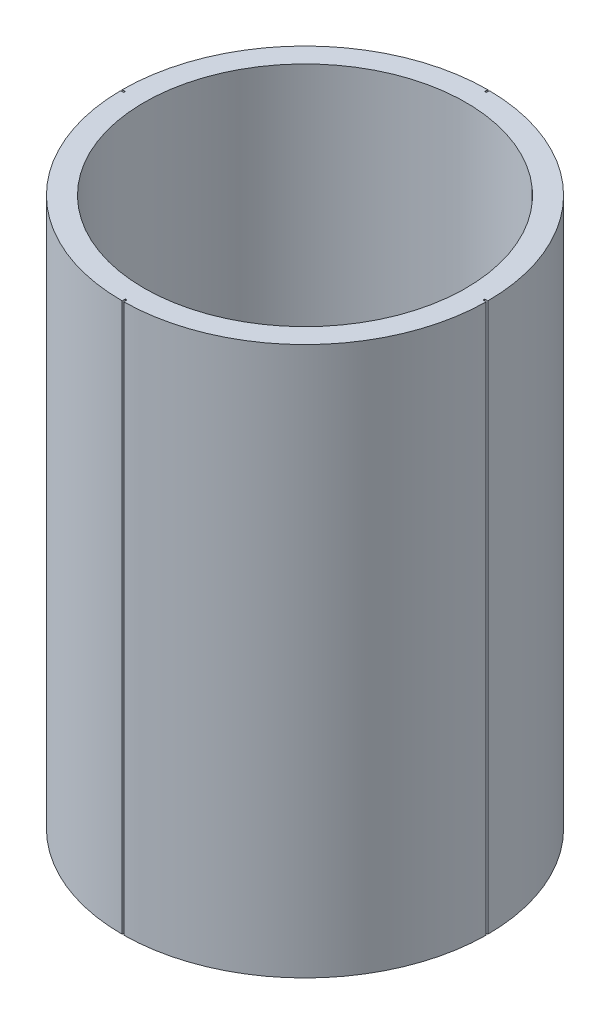
ISO-10303-21;
HEADER;
FILE_DESCRIPTION(('STEP AP214'),'2;1');
FILE_NAME('part.step','',(''),(''),'','','');
FILE_SCHEMA(('AUTOMOTIVE_DESIGN { 1 0 10303 214 1 1 1 1 }'));
ENDSEC;
DATA;
#1=APPLICATION_CONTEXT('core data for automotive mechanical design processes');
#2=APPLICATION_PROTOCOL_DEFINITION('international standard','automotive_design',2000,#1);
#3=PRODUCT_CONTEXT('',#1,'mechanical');
#4=PRODUCT('Part','Part','',(#3));
#5=PRODUCT_RELATED_PRODUCT_CATEGORY('part','',(#4));
#6=PRODUCT_DEFINITION_FORMATION('','',#4);
#7=PRODUCT_DEFINITION_CONTEXT('part definition',#1,'design');
#8=PRODUCT_DEFINITION('design','',#6,#7);
#9=PRODUCT_DEFINITION_SHAPE('','',#8);
#10=(LENGTH_UNIT() NAMED_UNIT(*) SI_UNIT(.MILLI.,.METRE.));
#11=(NAMED_UNIT(*) PLANE_ANGLE_UNIT() SI_UNIT($,.RADIAN.));
#12=(NAMED_UNIT(*) SI_UNIT($,.STERADIAN.) SOLID_ANGLE_UNIT());
#13=UNCERTAINTY_MEASURE_WITH_UNIT(LENGTH_MEASURE(1.E-05),#10,'distance_accuracy_value','');
#14=(GEOMETRIC_REPRESENTATION_CONTEXT(3) GLOBAL_UNCERTAINTY_ASSIGNED_CONTEXT((#13)) GLOBAL_UNIT_ASSIGNED_CONTEXT((#10,
#11,#12)) REPRESENTATION_CONTEXT('',''));
#15=CARTESIAN_POINT('',(0.,0.,0.));
#16=DIRECTION('',(0.,0.,1.));
#17=DIRECTION('',(1.,0.,0.));
#18=AXIS2_PLACEMENT_3D('',#15,#16,#17);
#19=CARTESIAN_POINT('',(0.,15.,0.));
#20=DIRECTION('',(0.,1.,0.));
#21=DIRECTION('',(0.,0.,1.));
#22=AXIS2_PLACEMENT_3D('',#19,#20,#21);
#23=PLANE('',#22);
#24=CARTESIAN_POINT('',(0.,15.,0.));
#25=DIRECTION('',(0.,1.,0.));
#26=DIRECTION('',(0.,0.,1.));
#27=AXIS2_PLACEMENT_3D('',#24,#25,#26);
#28=CIRCLE('',#27,5.);
#29=CARTESIAN_POINT('',(0.0436326774918692,15.,4.99980961532086));
#30=VERTEX_POINT('',#29);
#31=CARTESIAN_POINT('',(4.99980961532086,15.,0.0436326774918726));
#32=VERTEX_POINT('',#31);
#33=EDGE_CURVE('E208',#30,#32,#28,.T.);
#34=ORIENTED_EDGE('',*,*,#33,.T.);
#35=DIRECTION('',(-0.999961923064171,0.,-0.00872653549837457));
#36=VECTOR('',#35,1.);
#37=CARTESIAN_POINT('',(4.99980961532086,15.,0.0436326774918726));
#38=LINE('',#37,#36);
#39=CARTESIAN_POINT('',(4.9150518983708,15.,0.0428930081018029));
#40=VERTEX_POINT('',#39);
#41=EDGE_CURVE('E116',#32,#40,#38,.T.);
#42=ORIENTED_EDGE('',*,*,#41,.T.);
#43=DIRECTION('',(0.,0.,-1.));
#44=VECTOR('',#43,1.);
#45=CARTESIAN_POINT('',(4.9150518983708,15.,0.));
#46=LINE('',#45,#44);
#47=CARTESIAN_POINT('',(4.9150518983708,15.,0.));
#48=VERTEX_POINT('',#47);
#49=EDGE_CURVE('E247',#40,#48,#46,.T.);
#50=ORIENTED_EDGE('',*,*,#49,.T.);
#51=DIRECTION('',(1.,0.,0.));
#52=VECTOR('',#51,1.);
#53=CARTESIAN_POINT('',(4.9150518983708,15.,0.));
#54=LINE('',#53,#52);
#55=CARTESIAN_POINT('',(5.,15.,0.));
#56=VERTEX_POINT('',#55);
#57=EDGE_CURVE('E266',#48,#56,#54,.T.);
#58=ORIENTED_EDGE('',*,*,#57,.T.);
#59=CARTESIAN_POINT('',(0.,15.,0.));
#60=DIRECTION('',(0.,1.,0.));
#61=DIRECTION('',(0.,0.,1.));
#62=AXIS2_PLACEMENT_3D('',#59,#60,#61);
#63=CIRCLE('',#62,5.);
#64=CARTESIAN_POINT('',(0.0436326774918698,15.,-4.99980961532086));
#65=VERTEX_POINT('',#64);
#66=EDGE_CURVE('E263',#56,#65,#63,.T.);
#67=ORIENTED_EDGE('',*,*,#66,.T.);
#68=DIRECTION('',(-0.00872653549837389,0.,0.999961923064171));
#69=VECTOR('',#68,1.);
#70=CARTESIAN_POINT('',(0.0436326774918692,15.,-4.99980961532086));
#71=LINE('',#70,#69);
#72=CARTESIAN_POINT('',(0.0428689280640921,15.,-4.91229259935485));
#73=VERTEX_POINT('',#72);
#74=EDGE_CURVE('E265',#65,#73,#71,.T.);
#75=ORIENTED_EDGE('',*,*,#74,.T.);
#76=DIRECTION('',(-1.,0.,0.));
#77=VECTOR('',#76,1.);
#78=CARTESIAN_POINT('',(0.,15.,-4.91229259935485));
#79=LINE('',#78,#77);
#80=CARTESIAN_POINT('',(0.,15.,-4.91229259935485));
#81=VERTEX_POINT('',#80);
#82=EDGE_CURVE('E268',#73,#81,#79,.T.);
#83=ORIENTED_EDGE('',*,*,#82,.T.);
#84=DIRECTION('',(0.,0.,-1.));
#85=VECTOR('',#84,1.);
#86=CARTESIAN_POINT('',(0.,15.,-5.));
#87=LINE('',#86,#85);
#88=CARTESIAN_POINT('',(0.,15.,-5.));
#89=VERTEX_POINT('',#88);
#90=EDGE_CURVE('E274',#81,#89,#87,.T.);
#91=ORIENTED_EDGE('',*,*,#90,.T.);
#92=CARTESIAN_POINT('',(0.,15.,0.));
#93=DIRECTION('',(0.,1.,0.));
#94=DIRECTION('',(0.,0.,1.));
#95=AXIS2_PLACEMENT_3D('',#92,#93,#94);
#96=CIRCLE('',#95,5.);
#97=CARTESIAN_POINT('',(-5.,15.,0.));
#98=VERTEX_POINT('',#97);
#99=EDGE_CURVE('E276',#89,#98,#96,.T.);
#100=ORIENTED_EDGE('',*,*,#99,.T.);
#101=DIRECTION('',(1.,0.,0.));
#102=VECTOR('',#101,1.);
#103=CARTESIAN_POINT('',(-5.,15.,0.));
#104=LINE('',#103,#102);
#105=CARTESIAN_POINT('',(-4.9150518983708,15.,0.));
#106=VERTEX_POINT('',#105);
#107=EDGE_CURVE('E278',#98,#106,#104,.T.);
#108=ORIENTED_EDGE('',*,*,#107,.T.);
#109=DIRECTION('',(0.,0.,1.));
#110=VECTOR('',#109,1.);
#111=CARTESIAN_POINT('',(-4.9150518983708,15.,0.));
#112=LINE('',#111,#110);
#113=CARTESIAN_POINT('',(-4.9150518983708,15.,0.0428930081018029));
#114=VERTEX_POINT('',#113);
#115=EDGE_CURVE('E280',#106,#114,#112,.T.);
#116=ORIENTED_EDGE('',*,*,#115,.T.);
#117=DIRECTION('',(-0.999961923064171,0.,0.00872653549837457));
#118=VECTOR('',#117,1.);
#119=CARTESIAN_POINT('',(-4.99980961532086,15.,0.0436326774918726));
#120=LINE('',#119,#118);
#121=CARTESIAN_POINT('',(-4.99980961532086,15.,0.0436326774918726));
#122=VERTEX_POINT('',#121);
#123=EDGE_CURVE('E282',#114,#122,#120,.T.);
#124=ORIENTED_EDGE('',*,*,#123,.T.);
#125=CARTESIAN_POINT('',(0.,15.,0.));
#126=DIRECTION('',(0.,1.,0.));
#127=DIRECTION('',(0.,0.,1.));
#128=AXIS2_PLACEMENT_3D('',#125,#126,#127);
#129=CIRCLE('',#128,5.);
#130=CARTESIAN_POINT('',(0.,15.,5.));
#131=VERTEX_POINT('',#130);
#132=EDGE_CURVE('E159',#122,#131,#129,.T.);
#133=ORIENTED_EDGE('',*,*,#132,.T.);
#134=DIRECTION('',(0.,0.,-1.));
#135=VECTOR('',#134,1.);
#136=CARTESIAN_POINT('',(0.,15.,5.));
#137=LINE('',#136,#135);
#138=CARTESIAN_POINT('',(0.,15.,4.91229259935485));
#139=VERTEX_POINT('',#138);
#140=EDGE_CURVE('E153',#131,#139,#137,.T.);
#141=ORIENTED_EDGE('',*,*,#140,.T.);
#142=DIRECTION('',(1.,0.,0.));
#143=VECTOR('',#142,1.);
#144=CARTESIAN_POINT('',(0.,15.,4.91229259935485));
#145=LINE('',#144,#143);
#146=CARTESIAN_POINT('',(0.0428689280640921,15.,4.91229259935485));
#147=VERTEX_POINT('',#146);
#148=EDGE_CURVE('E157',#139,#147,#145,.T.);
#149=ORIENTED_EDGE('',*,*,#148,.T.);
#150=DIRECTION('',(0.00872653549837389,0.,0.999961923064171));
#151=VECTOR('',#150,1.);
#152=CARTESIAN_POINT('',(0.0436326774918692,15.,4.99980961532086));
#153=LINE('',#152,#151);
#154=EDGE_CURVE('E49',#147,#30,#153,.T.);
#155=ORIENTED_EDGE('',*,*,#154,.T.);
#156=EDGE_LOOP('',(#34,#42,#50,#58,#67,#75,#83,#91,#100,#108,#116,#124,#133,#141,#149,#155));
#157=FACE_BOUND('',#156,.T.);
#158=CARTESIAN_POINT('',(0.,15.,0.));
#159=DIRECTION('',(0.,1.,0.));
#160=DIRECTION('',(0.,0.,1.));
#161=AXIS2_PLACEMENT_3D('',#158,#159,#160);
#162=CIRCLE('',#161,4.4);
#163=CARTESIAN_POINT('',(0.,15.,4.4));
#164=VERTEX_POINT('',#163);
#165=EDGE_CURVE('E181',#164,#164,#162,.T.);
#166=ORIENTED_EDGE('',*,*,#165,.F.);
#167=EDGE_LOOP('',(#166));
#168=FACE_BOUND('',#167,.T.);
#169=ADVANCED_FACE('F32',(#157,#168),#23,.T.);
#170=CARTESIAN_POINT('',(0.,0.,0.));
#171=DIRECTION('',(0.,1.,0.));
#172=DIRECTION('',(0.,0.,1.));
#173=AXIS2_PLACEMENT_3D('',#170,#171,#172);
#174=PLANE('',#173);
#175=CARTESIAN_POINT('',(0.,0.,0.));
#176=DIRECTION('',(0.,1.,0.));
#177=DIRECTION('',(0.,0.,1.));
#178=AXIS2_PLACEMENT_3D('',#175,#176,#177);
#179=CIRCLE('',#178,5.);
#180=CARTESIAN_POINT('',(0.0436326774918692,0.,4.99980961532086));
#181=VERTEX_POINT('',#180);
#182=CARTESIAN_POINT('',(4.99980961532086,0.,0.0436326774918726));
#183=VERTEX_POINT('',#182);
#184=EDGE_CURVE('E177',#181,#183,#179,.T.);
#185=ORIENTED_EDGE('',*,*,#184,.F.);
#186=DIRECTION('',(0.00872653549837389,0.,0.999961923064171));
#187=VECTOR('',#186,1.);
#188=CARTESIAN_POINT('',(0.0436326774918692,0.,4.99980961532086));
#189=LINE('',#188,#187);
#190=CARTESIAN_POINT('',(0.0428689280640921,0.,4.91229259935485));
#191=VERTEX_POINT('',#190);
#192=EDGE_CURVE('E108',#191,#181,#189,.T.);
#193=ORIENTED_EDGE('',*,*,#192,.F.);
#194=DIRECTION('',(1.,0.,0.));
#195=VECTOR('',#194,1.);
#196=CARTESIAN_POINT('',(0.,0.,4.91229259935485));
#197=LINE('',#196,#195);
#198=CARTESIAN_POINT('',(0.,0.,4.91229259935485));
#199=VERTEX_POINT('',#198);
#200=EDGE_CURVE('E102',#199,#191,#197,.T.);
#201=ORIENTED_EDGE('',*,*,#200,.F.);
#202=DIRECTION('',(0.,0.,-1.));
#203=VECTOR('',#202,1.);
#204=CARTESIAN_POINT('',(0.,0.,5.));
#205=LINE('',#204,#203);
#206=CARTESIAN_POINT('',(0.,0.,5.));
#207=VERTEX_POINT('',#206);
#208=EDGE_CURVE('E167',#207,#199,#205,.T.);
#209=ORIENTED_EDGE('',*,*,#208,.F.);
#210=CARTESIAN_POINT('',(0.,0.,0.));
#211=DIRECTION('',(0.,1.,0.));
#212=DIRECTION('',(0.,0.,1.));
#213=AXIS2_PLACEMENT_3D('',#210,#211,#212);
#214=CIRCLE('',#213,5.);
#215=CARTESIAN_POINT('',(-4.99980961532086,0.,0.0436326774918726));
#216=VERTEX_POINT('',#215);
#217=EDGE_CURVE('E203',#216,#207,#214,.T.);
#218=ORIENTED_EDGE('',*,*,#217,.F.);
#219=DIRECTION('',(-0.999961923064171,0.,0.00872653549837457));
#220=VECTOR('',#219,1.);
#221=CARTESIAN_POINT('',(-4.99980961532086,0.,0.0436326774918726));
#222=LINE('',#221,#220);
#223=CARTESIAN_POINT('',(-4.9150518983708,0.,0.0428930081018029));
#224=VERTEX_POINT('',#223);
#225=EDGE_CURVE('E201',#224,#216,#222,.T.);
#226=ORIENTED_EDGE('',*,*,#225,.F.);
#227=DIRECTION('',(0.,0.,1.));
#228=VECTOR('',#227,1.);
#229=CARTESIAN_POINT('',(-4.9150518983708,0.,0.));
#230=LINE('',#229,#228);
#231=CARTESIAN_POINT('',(-4.9150518983708,0.,0.));
#232=VERTEX_POINT('',#231);
#233=EDGE_CURVE('E199',#232,#224,#230,.T.);
#234=ORIENTED_EDGE('',*,*,#233,.F.);
#235=DIRECTION('',(1.,0.,0.));
#236=VECTOR('',#235,1.);
#237=CARTESIAN_POINT('',(-5.,0.,0.));
#238=LINE('',#237,#236);
#239=CARTESIAN_POINT('',(-5.,0.,0.));
#240=VERTEX_POINT('',#239);
#241=EDGE_CURVE('E197',#240,#232,#238,.T.);
#242=ORIENTED_EDGE('',*,*,#241,.F.);
#243=CARTESIAN_POINT('',(0.,0.,0.));
#244=DIRECTION('',(0.,1.,0.));
#245=DIRECTION('',(0.,0.,1.));
#246=AXIS2_PLACEMENT_3D('',#243,#244,#245);
#247=CIRCLE('',#246,5.);
#248=CARTESIAN_POINT('',(0.,0.,-5.));
#249=VERTEX_POINT('',#248);
#250=EDGE_CURVE('E195',#249,#240,#247,.T.);
#251=ORIENTED_EDGE('',*,*,#250,.F.);
#252=DIRECTION('',(0.,0.,-1.));
#253=VECTOR('',#252,1.);
#254=CARTESIAN_POINT('',(0.,0.,-5.));
#255=LINE('',#254,#253);
#256=CARTESIAN_POINT('',(0.,0.,-4.91229259935485));
#257=VERTEX_POINT('',#256);
#258=EDGE_CURVE('E193',#257,#249,#255,.T.);
#259=ORIENTED_EDGE('',*,*,#258,.F.);
#260=DIRECTION('',(-1.,0.,0.));
#261=VECTOR('',#260,1.);
#262=CARTESIAN_POINT('',(0.,0.,-4.91229259935485));
#263=LINE('',#262,#261);
#264=CARTESIAN_POINT('',(0.0428689280640921,0.,-4.91229259935485));
#265=VERTEX_POINT('',#264);
#266=EDGE_CURVE('E191',#265,#257,#263,.T.);
#267=ORIENTED_EDGE('',*,*,#266,.F.);
#268=DIRECTION('',(-0.00872653549837389,0.,0.999961923064171));
#269=VECTOR('',#268,1.);
#270=CARTESIAN_POINT('',(0.0436326774918692,0.,-4.99980961532086));
#271=LINE('',#270,#269);
#272=CARTESIAN_POINT('',(0.0436326774918698,0.,-4.99980961532086));
#273=VERTEX_POINT('',#272);
#274=EDGE_CURVE('E189',#273,#265,#271,.T.);
#275=ORIENTED_EDGE('',*,*,#274,.F.);
#276=CARTESIAN_POINT('',(0.,0.,0.));
#277=DIRECTION('',(0.,1.,0.));
#278=DIRECTION('',(0.,0.,1.));
#279=AXIS2_PLACEMENT_3D('',#276,#277,#278);
#280=CIRCLE('',#279,5.);
#281=CARTESIAN_POINT('',(5.,0.,0.));
#282=VERTEX_POINT('',#281);
#283=EDGE_CURVE('E187',#282,#273,#280,.T.);
#284=ORIENTED_EDGE('',*,*,#283,.F.);
#285=DIRECTION('',(1.,0.,0.));
#286=VECTOR('',#285,1.);
#287=CARTESIAN_POINT('',(4.9150518983708,0.,0.));
#288=LINE('',#287,#286);
#289=CARTESIAN_POINT('',(4.9150518983708,0.,0.));
#290=VERTEX_POINT('',#289);
#291=EDGE_CURVE('E185',#290,#282,#288,.T.);
#292=ORIENTED_EDGE('',*,*,#291,.F.);
#293=DIRECTION('',(0.,0.,-1.));
#294=VECTOR('',#293,1.);
#295=CARTESIAN_POINT('',(4.9150518983708,0.,0.));
#296=LINE('',#295,#294);
#297=CARTESIAN_POINT('',(4.9150518983708,0.,0.0428930081018029));
#298=VERTEX_POINT('',#297);
#299=EDGE_CURVE('E183',#298,#290,#296,.T.);
#300=ORIENTED_EDGE('',*,*,#299,.F.);
#301=DIRECTION('',(-0.999961923064171,0.,-0.00872653549837457));
#302=VECTOR('',#301,1.);
#303=CARTESIAN_POINT('',(4.99980961532086,0.,0.0436326774918726));
#304=LINE('',#303,#302);
#305=EDGE_CURVE('E180',#183,#298,#304,.T.);
#306=ORIENTED_EDGE('',*,*,#305,.F.);
#307=EDGE_LOOP('',(#185,#193,#201,#209,#218,#226,#234,#242,#251,#259,#267,#275,#284,#292,#300,#306));
#308=FACE_BOUND('',#307,.T.);
#309=CARTESIAN_POINT('',(0.,0.,0.));
#310=DIRECTION('',(0.,1.,0.));
#311=DIRECTION('',(0.,0.,1.));
#312=AXIS2_PLACEMENT_3D('',#309,#310,#311);
#313=CIRCLE('',#312,4.4);
#314=CARTESIAN_POINT('',(0.,0.,4.4));
#315=VERTEX_POINT('',#314);
#316=EDGE_CURVE('E481',#315,#315,#313,.T.);
#317=ORIENTED_EDGE('',*,*,#316,.T.);
#318=EDGE_LOOP('',(#317));
#319=FACE_BOUND('',#318,.T.);
#320=ADVANCED_FACE('F251',(#308,#319),#174,.F.);
#321=CARTESIAN_POINT('',(0.,15.,0.));
#322=DIRECTION('',(0.,-1.,0.));
#323=DIRECTION('',(0.,0.,-1.));
#324=AXIS2_PLACEMENT_3D('',#321,#322,#323);
#325=CYLINDRICAL_SURFACE('',#324,5.);
#326=ORIENTED_EDGE('',*,*,#184,.T.);
#327=DIRECTION('',(0.,-1.,0.));
#328=VECTOR('',#327,1.);
#329=CARTESIAN_POINT('',(4.99980961532086,15.,0.0436326774918726));
#330=LINE('',#329,#328);
#331=EDGE_CURVE('E11',#32,#183,#330,.T.);
#332=ORIENTED_EDGE('',*,*,#331,.F.);
#333=ORIENTED_EDGE('',*,*,#33,.F.);
#334=DIRECTION('',(0.,-1.,0.));
#335=VECTOR('',#334,1.);
#336=CARTESIAN_POINT('',(0.0436326774918692,15.,4.99980961532086));
#337=LINE('',#336,#335);
#338=EDGE_CURVE('E173',#30,#181,#337,.T.);
#339=ORIENTED_EDGE('',*,*,#338,.T.);
#340=EDGE_LOOP('',(#326,#332,#333,#339));
#341=FACE_BOUND('',#340,.T.);
#342=ADVANCED_FACE('F34',(#341),#325,.T.);
#343=CARTESIAN_POINT('',(4.99980961532086,15.,0.0436326774918726));
#344=DIRECTION('',(-0.00872653549837457,0.,0.999961923064171));
#345=DIRECTION('',(0.999961923064171,0.,0.00872653549837457));
#346=AXIS2_PLACEMENT_3D('',#343,#344,#345);
#347=PLANE('',#346);
#348=ORIENTED_EDGE('',*,*,#305,.T.);
#349=DIRECTION('',(0.,-1.,0.));
#350=VECTOR('',#349,1.);
#351=CARTESIAN_POINT('',(4.9150518983708,15.,0.0428930081018029));
#352=LINE('',#351,#350);
#353=EDGE_CURVE('E41',#40,#298,#352,.T.);
#354=ORIENTED_EDGE('',*,*,#353,.F.);
#355=ORIENTED_EDGE('',*,*,#41,.F.);
#356=ORIENTED_EDGE('',*,*,#331,.T.);
#357=EDGE_LOOP('',(#348,#354,#355,#356));
#358=FACE_BOUND('',#357,.T.);
#359=ADVANCED_FACE('F316',(#358),#347,.F.);
#360=CARTESIAN_POINT('',(4.9150518983708,15.,0.));
#361=DIRECTION('',(-1.,0.,0.));
#362=DIRECTION('',(0.,0.,1.));
#363=AXIS2_PLACEMENT_3D('',#360,#361,#362);
#364=PLANE('',#363);
#365=ORIENTED_EDGE('',*,*,#299,.T.);
#366=DIRECTION('',(0.,-1.,0.));
#367=VECTOR('',#366,1.);
#368=CARTESIAN_POINT('',(4.9150518983708,15.,0.));
#369=LINE('',#368,#367);
#370=EDGE_CURVE('E239',#48,#290,#369,.T.);
#371=ORIENTED_EDGE('',*,*,#370,.F.);
#372=ORIENTED_EDGE('',*,*,#49,.F.);
#373=ORIENTED_EDGE('',*,*,#353,.T.);
#374=EDGE_LOOP('',(#365,#371,#372,#373));
#375=FACE_BOUND('',#374,.T.);
#376=ADVANCED_FACE('F245',(#375),#364,.F.);
#377=CARTESIAN_POINT('',(4.9150518983708,15.,0.));
#378=DIRECTION('',(0.,0.,-1.));
#379=DIRECTION('',(-1.,0.,0.));
#380=AXIS2_PLACEMENT_3D('',#377,#378,#379);
#381=PLANE('',#380);
#382=ORIENTED_EDGE('',*,*,#291,.T.);
#383=DIRECTION('',(0.,-1.,0.));
#384=VECTOR('',#383,1.);
#385=CARTESIAN_POINT('',(5.,15.,0.));
#386=LINE('',#385,#384);
#387=EDGE_CURVE('E236',#56,#282,#386,.T.);
#388=ORIENTED_EDGE('',*,*,#387,.F.);
#389=ORIENTED_EDGE('',*,*,#57,.F.);
#390=ORIENTED_EDGE('',*,*,#370,.T.);
#391=EDGE_LOOP('',(#382,#388,#389,#390));
#392=FACE_BOUND('',#391,.T.);
#393=ADVANCED_FACE('F257',(#392),#381,.F.);
#394=CARTESIAN_POINT('',(0.,15.,0.));
#395=DIRECTION('',(0.,-1.,0.));
#396=DIRECTION('',(0.,0.,-1.));
#397=AXIS2_PLACEMENT_3D('',#394,#395,#396);
#398=CYLINDRICAL_SURFACE('',#397,5.);
#399=ORIENTED_EDGE('',*,*,#283,.T.);
#400=DIRECTION('',(0.,-1.,0.));
#401=VECTOR('',#400,1.);
#402=CARTESIAN_POINT('',(0.0436326774918698,15.,-4.99980961532086));
#403=LINE('',#402,#401);
#404=EDGE_CURVE('E233',#65,#273,#403,.T.);
#405=ORIENTED_EDGE('',*,*,#404,.F.);
#406=ORIENTED_EDGE('',*,*,#66,.F.);
#407=ORIENTED_EDGE('',*,*,#387,.T.);
#408=EDGE_LOOP('',(#399,#405,#406,#407));
#409=FACE_BOUND('',#408,.T.);
#410=ADVANCED_FACE('F261',(#409),#398,.T.);
#411=CARTESIAN_POINT('',(0.0436326774918692,15.,-4.99980961532086));
#412=DIRECTION('',(0.999961923064171,0.,0.00872653549837389));
#413=DIRECTION('',(0.00872653549837389,0.,-0.999961923064171));
#414=AXIS2_PLACEMENT_3D('',#411,#412,#413);
#415=PLANE('',#414);
#416=ORIENTED_EDGE('',*,*,#274,.T.);
#417=DIRECTION('',(0.,-1.,0.));
#418=VECTOR('',#417,1.);
#419=CARTESIAN_POINT('',(0.0428689280640921,15.,-4.91229259935485));
#420=LINE('',#419,#418);
#421=EDGE_CURVE('E230',#73,#265,#420,.T.);
#422=ORIENTED_EDGE('',*,*,#421,.F.);
#423=ORIENTED_EDGE('',*,*,#74,.F.);
#424=ORIENTED_EDGE('',*,*,#404,.T.);
#425=EDGE_LOOP('',(#416,#422,#423,#424));
#426=FACE_BOUND('',#425,.T.);
#427=ADVANCED_FACE('F329',(#426),#415,.F.);
#428=CARTESIAN_POINT('',(0.,15.,-4.91229259935485));
#429=DIRECTION('',(0.,0.,1.));
#430=DIRECTION('',(1.,0.,0.));
#431=AXIS2_PLACEMENT_3D('',#428,#429,#430);
#432=PLANE('',#431);
#433=ORIENTED_EDGE('',*,*,#266,.T.);
#434=DIRECTION('',(0.,-1.,0.));
#435=VECTOR('',#434,1.);
#436=CARTESIAN_POINT('',(0.,15.,-4.91229259935485));
#437=LINE('',#436,#435);
#438=EDGE_CURVE('E227',#81,#257,#437,.T.);
#439=ORIENTED_EDGE('',*,*,#438,.F.);
#440=ORIENTED_EDGE('',*,*,#82,.F.);
#441=ORIENTED_EDGE('',*,*,#421,.T.);
#442=EDGE_LOOP('',(#433,#439,#440,#441));
#443=FACE_BOUND('',#442,.T.);
#444=ADVANCED_FACE('F332',(#443),#432,.F.);
#445=CARTESIAN_POINT('',(0.,15.,-5.));
#446=DIRECTION('',(-1.,0.,0.));
#447=DIRECTION('',(0.,0.,1.));
#448=AXIS2_PLACEMENT_3D('',#445,#446,#447);
#449=PLANE('',#448);
#450=ORIENTED_EDGE('',*,*,#258,.T.);
#451=DIRECTION('',(0.,-1.,0.));
#452=VECTOR('',#451,1.);
#453=CARTESIAN_POINT('',(0.,15.,-5.));
#454=LINE('',#453,#452);
#455=EDGE_CURVE('E224',#89,#249,#454,.T.);
#456=ORIENTED_EDGE('',*,*,#455,.F.);
#457=ORIENTED_EDGE('',*,*,#90,.F.);
#458=ORIENTED_EDGE('',*,*,#438,.T.);
#459=EDGE_LOOP('',(#450,#456,#457,#458));
#460=FACE_BOUND('',#459,.T.);
#461=ADVANCED_FACE('F336',(#460),#449,.F.);
#462=CARTESIAN_POINT('',(0.,15.,0.));
#463=DIRECTION('',(0.,-1.,0.));
#464=DIRECTION('',(0.,0.,-1.));
#465=AXIS2_PLACEMENT_3D('',#462,#463,#464);
#466=CYLINDRICAL_SURFACE('',#465,5.);
#467=ORIENTED_EDGE('',*,*,#250,.T.);
#468=DIRECTION('',(0.,-1.,0.));
#469=VECTOR('',#468,1.);
#470=CARTESIAN_POINT('',(-5.,15.,0.));
#471=LINE('',#470,#469);
#472=EDGE_CURVE('E221',#98,#240,#471,.T.);
#473=ORIENTED_EDGE('',*,*,#472,.F.);
#474=ORIENTED_EDGE('',*,*,#99,.F.);
#475=ORIENTED_EDGE('',*,*,#455,.T.);
#476=EDGE_LOOP('',(#467,#473,#474,#475));
#477=FACE_BOUND('',#476,.T.);
#478=ADVANCED_FACE('F340',(#477),#466,.T.);
#479=CARTESIAN_POINT('',(-5.,15.,0.));
#480=DIRECTION('',(0.,0.,-1.));
#481=DIRECTION('',(-1.,0.,0.));
#482=AXIS2_PLACEMENT_3D('',#479,#480,#481);
#483=PLANE('',#482);
#484=ORIENTED_EDGE('',*,*,#241,.T.);
#485=DIRECTION('',(0.,-1.,0.));
#486=VECTOR('',#485,1.);
#487=CARTESIAN_POINT('',(-4.9150518983708,15.,0.));
#488=LINE('',#487,#486);
#489=EDGE_CURVE('E218',#106,#232,#488,.T.);
#490=ORIENTED_EDGE('',*,*,#489,.F.);
#491=ORIENTED_EDGE('',*,*,#107,.F.);
#492=ORIENTED_EDGE('',*,*,#472,.T.);
#493=EDGE_LOOP('',(#484,#490,#491,#492));
#494=FACE_BOUND('',#493,.T.);
#495=ADVANCED_FACE('F344',(#494),#483,.F.);
#496=CARTESIAN_POINT('',(-4.9150518983708,15.,0.));
#497=DIRECTION('',(1.,0.,0.));
#498=DIRECTION('',(0.,0.,-1.));
#499=AXIS2_PLACEMENT_3D('',#496,#497,#498);
#500=PLANE('',#499);
#501=ORIENTED_EDGE('',*,*,#233,.T.);
#502=DIRECTION('',(0.,-1.,0.));
#503=VECTOR('',#502,1.);
#504=CARTESIAN_POINT('',(-4.9150518983708,15.,0.0428930081018029));
#505=LINE('',#504,#503);
#506=EDGE_CURVE('E215',#114,#224,#505,.T.);
#507=ORIENTED_EDGE('',*,*,#506,.F.);
#508=ORIENTED_EDGE('',*,*,#115,.F.);
#509=ORIENTED_EDGE('',*,*,#489,.T.);
#510=EDGE_LOOP('',(#501,#507,#508,#509));
#511=FACE_BOUND('',#510,.T.);
#512=ADVANCED_FACE('F348',(#511),#500,.F.);
#513=CARTESIAN_POINT('',(-4.99980961532086,15.,0.0436326774918726));
#514=DIRECTION('',(0.00872653549837457,0.,0.999961923064171));
#515=DIRECTION('',(0.999961923064171,0.,-0.00872653549837457));
#516=AXIS2_PLACEMENT_3D('',#513,#514,#515);
#517=PLANE('',#516);
#518=ORIENTED_EDGE('',*,*,#225,.T.);
#519=DIRECTION('',(0.,-1.,0.));
#520=VECTOR('',#519,1.);
#521=CARTESIAN_POINT('',(-4.99980961532086,15.,0.0436326774918726));
#522=LINE('',#521,#520);
#523=EDGE_CURVE('E212',#122,#216,#522,.T.);
#524=ORIENTED_EDGE('',*,*,#523,.F.);
#525=ORIENTED_EDGE('',*,*,#123,.F.);
#526=ORIENTED_EDGE('',*,*,#506,.T.);
#527=EDGE_LOOP('',(#518,#524,#525,#526));
#528=FACE_BOUND('',#527,.T.);
#529=ADVANCED_FACE('F288',(#528),#517,.F.);
#530=CARTESIAN_POINT('',(0.,15.,0.));
#531=DIRECTION('',(0.,-1.,0.));
#532=DIRECTION('',(0.,0.,-1.));
#533=AXIS2_PLACEMENT_3D('',#530,#531,#532);
#534=CYLINDRICAL_SURFACE('',#533,5.);
#535=ORIENTED_EDGE('',*,*,#217,.T.);
#536=DIRECTION('',(0.,-1.,0.));
#537=VECTOR('',#536,1.);
#538=CARTESIAN_POINT('',(0.,15.,5.));
#539=LINE('',#538,#537);
#540=EDGE_CURVE('E168',#131,#207,#539,.T.);
#541=ORIENTED_EDGE('',*,*,#540,.F.);
#542=ORIENTED_EDGE('',*,*,#132,.F.);
#543=ORIENTED_EDGE('',*,*,#523,.T.);
#544=EDGE_LOOP('',(#535,#541,#542,#543));
#545=FACE_BOUND('',#544,.T.);
#546=ADVANCED_FACE('F292',(#545),#534,.T.);
#547=CARTESIAN_POINT('',(0.,15.,5.));
#548=DIRECTION('',(-1.,0.,0.));
#549=DIRECTION('',(0.,0.,1.));
#550=AXIS2_PLACEMENT_3D('',#547,#548,#549);
#551=PLANE('',#550);
#552=ORIENTED_EDGE('',*,*,#208,.T.);
#553=DIRECTION('',(0.,-1.,0.));
#554=VECTOR('',#553,1.);
#555=CARTESIAN_POINT('',(0.,15.,4.91229259935485));
#556=LINE('',#555,#554);
#557=EDGE_CURVE('E164',#139,#199,#556,.T.);
#558=ORIENTED_EDGE('',*,*,#557,.F.);
#559=ORIENTED_EDGE('',*,*,#140,.F.);
#560=ORIENTED_EDGE('',*,*,#540,.T.);
#561=EDGE_LOOP('',(#552,#558,#559,#560));
#562=FACE_BOUND('',#561,.T.);
#563=ADVANCED_FACE('F165',(#562),#551,.F.);
#564=CARTESIAN_POINT('',(0.,15.,4.91229259935485));
#565=DIRECTION('',(0.,0.,-1.));
#566=DIRECTION('',(-1.,0.,0.));
#567=AXIS2_PLACEMENT_3D('',#564,#565,#566);
#568=PLANE('',#567);
#569=ORIENTED_EDGE('',*,*,#200,.T.);
#570=DIRECTION('',(0.,-1.,0.));
#571=VECTOR('',#570,1.);
#572=CARTESIAN_POINT('',(0.0428689280640921,15.,4.91229259935485));
#573=LINE('',#572,#571);
#574=EDGE_CURVE('E169',#147,#191,#573,.T.);
#575=ORIENTED_EDGE('',*,*,#574,.F.);
#576=ORIENTED_EDGE('',*,*,#148,.F.);
#577=ORIENTED_EDGE('',*,*,#557,.T.);
#578=EDGE_LOOP('',(#569,#575,#576,#577));
#579=FACE_BOUND('',#578,.T.);
#580=ADVANCED_FACE('F171',(#579),#568,.F.);
#581=CARTESIAN_POINT('',(0.0436326774918692,15.,4.99980961532086));
#582=DIRECTION('',(0.999961923064171,0.,-0.00872653549837389));
#583=DIRECTION('',(-0.00872653549837389,0.,-0.999961923064171));
#584=AXIS2_PLACEMENT_3D('',#581,#582,#583);
#585=PLANE('',#584);
#586=ORIENTED_EDGE('',*,*,#192,.T.);
#587=ORIENTED_EDGE('',*,*,#338,.F.);
#588=ORIENTED_EDGE('',*,*,#154,.F.);
#589=ORIENTED_EDGE('',*,*,#574,.T.);
#590=EDGE_LOOP('',(#586,#587,#588,#589));
#591=FACE_BOUND('',#590,.T.);
#592=ADVANCED_FACE('F296',(#591),#585,.F.);
#593=CARTESIAN_POINT('',(0.,15.,0.));
#594=DIRECTION('',(0.,-1.,0.));
#595=DIRECTION('',(0.,0.,-1.));
#596=AXIS2_PLACEMENT_3D('',#593,#594,#595);
#597=CYLINDRICAL_SURFACE('',#596,4.4);
#598=ORIENTED_EDGE('',*,*,#165,.T.);
#599=EDGE_LOOP('',(#598));
#600=FACE_BOUND('',#599,.T.);
#601=ORIENTED_EDGE('',*,*,#316,.F.);
#602=EDGE_LOOP('',(#601));
#603=FACE_BOUND('',#602,.T.);
#604=ADVANCED_FACE('F298',(#600,#603),#597,.F.);
#605=CLOSED_SHELL('',(#169,#320,#342,#359,#376,#393,#410,#427,#444,#461,#478,#495,#512,#529,
#546,#563,#580,#592,#604));
#606=MANIFOLD_SOLID_BREP('B2',#605);
#607=ADVANCED_BREP_SHAPE_REPRESENTATION('',(#18,#606),#14);
#608=SHAPE_DEFINITION_REPRESENTATION(#9,#607);
ENDSEC;
END-ISO-10303-21;
